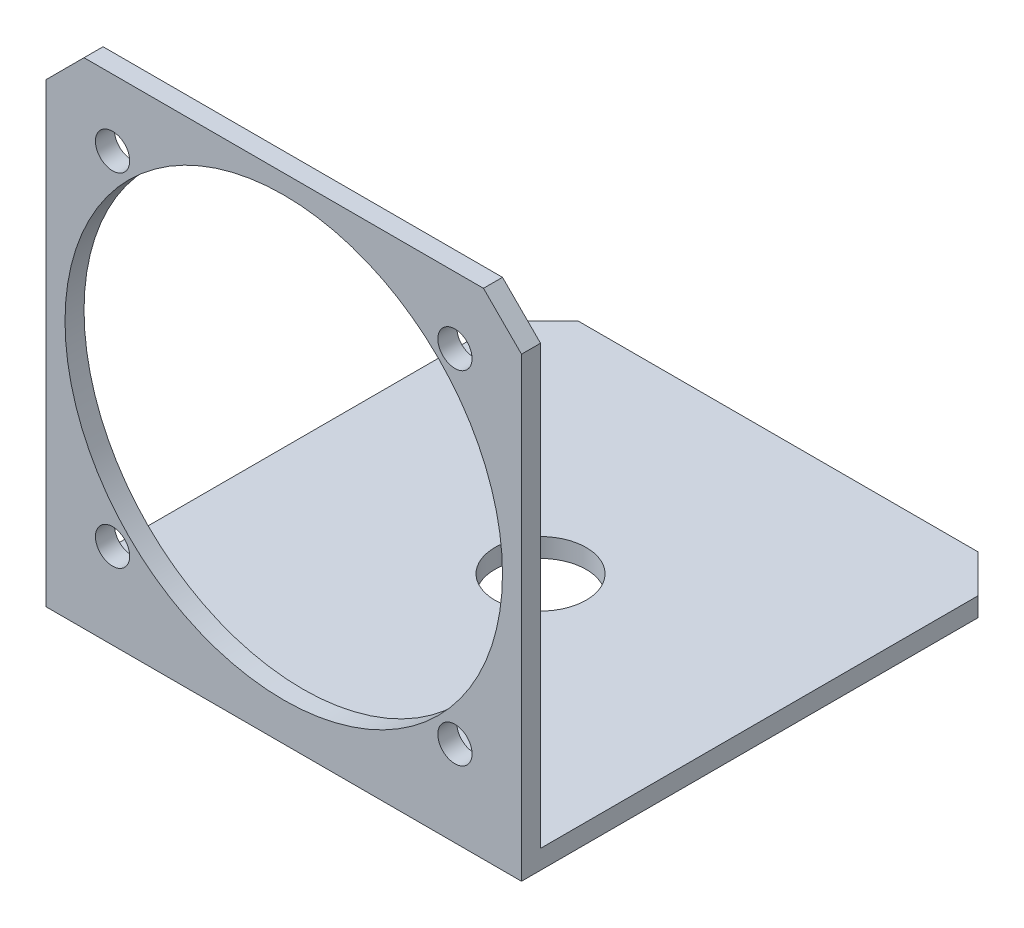
ISO-10303-21;
HEADER;
FILE_DESCRIPTION(('STEP AP214'),'2;1');
FILE_NAME('part.step','',(''),(''),'','','');
FILE_SCHEMA(('AUTOMOTIVE_DESIGN { 1 0 10303 214 1 1 1 1 }'));
ENDSEC;
DATA;
#1=APPLICATION_CONTEXT('core data for automotive mechanical design processes');
#2=APPLICATION_PROTOCOL_DEFINITION('international standard','automotive_design',2000,#1);
#3=PRODUCT_CONTEXT('',#1,'mechanical');
#4=PRODUCT('Part','Part','',(#3));
#5=PRODUCT_RELATED_PRODUCT_CATEGORY('part','',(#4));
#6=PRODUCT_DEFINITION_FORMATION('','',#4);
#7=PRODUCT_DEFINITION_CONTEXT('part definition',#1,'design');
#8=PRODUCT_DEFINITION('design','',#6,#7);
#9=PRODUCT_DEFINITION_SHAPE('','',#8);
#10=(LENGTH_UNIT() NAMED_UNIT(*) SI_UNIT(.MILLI.,.METRE.));
#11=(NAMED_UNIT(*) PLANE_ANGLE_UNIT() SI_UNIT($,.RADIAN.));
#12=(NAMED_UNIT(*) SI_UNIT($,.STERADIAN.) SOLID_ANGLE_UNIT());
#13=UNCERTAINTY_MEASURE_WITH_UNIT(LENGTH_MEASURE(1.E-05),#10,'distance_accuracy_value','');
#14=(GEOMETRIC_REPRESENTATION_CONTEXT(3) GLOBAL_UNCERTAINTY_ASSIGNED_CONTEXT((#13)) GLOBAL_UNIT_ASSIGNED_CONTEXT((#10,
#11,#12)) REPRESENTATION_CONTEXT('',''));
#15=CARTESIAN_POINT('',(0.,0.,0.));
#16=DIRECTION('',(0.,0.,1.));
#17=DIRECTION('',(1.,0.,0.));
#18=AXIS2_PLACEMENT_3D('',#15,#16,#17);
#19=CARTESIAN_POINT('',(0.,0.,1.27));
#20=DIRECTION('',(0.,0.,-1.));
#21=DIRECTION('',(-1.,0.,0.));
#22=AXIS2_PLACEMENT_3D('',#19,#20,#21);
#23=PLANE('',#22);
#24=DIRECTION('',(-1.,0.,0.));
#25=VECTOR('',#24,1.);
#26=CARTESIAN_POINT('',(-15.875,15.875,1.27));
#27=LINE('',#26,#25);
#28=CARTESIAN_POINT('',(13.335,15.875,1.27));
#29=VERTEX_POINT('',#28);
#30=CARTESIAN_POINT('',(-13.335,15.875,1.27));
#31=VERTEX_POINT('',#30);
#32=EDGE_CURVE('E134',#29,#31,#27,.T.);
#33=ORIENTED_EDGE('',*,*,#32,.T.);
#34=DIRECTION('',(0.70710678118655,0.707106781186546,0.));
#35=VECTOR('',#34,1.);
#36=CARTESIAN_POINT('',(-15.875,13.335,1.27));
#37=LINE('',#36,#35);
#38=CARTESIAN_POINT('',(-15.875,13.335,1.27));
#39=VERTEX_POINT('',#38);
#40=EDGE_CURVE('E209',#31,#39,#37,.F.);
#41=ORIENTED_EDGE('',*,*,#40,.T.);
#42=DIRECTION('',(0.,-1.,0.));
#43=VECTOR('',#42,1.);
#44=CARTESIAN_POINT('',(-15.875,-15.875,1.27));
#45=LINE('',#44,#43);
#46=CARTESIAN_POINT('',(-15.875,-17.145,1.27));
#47=VERTEX_POINT('',#46);
#48=EDGE_CURVE('E140',#39,#47,#45,.T.);
#49=ORIENTED_EDGE('',*,*,#48,.T.);
#50=DIRECTION('',(-1.,0.,0.));
#51=VECTOR('',#50,1.);
#52=CARTESIAN_POINT('',(15.875,-17.145,1.27));
#53=LINE('',#52,#51);
#54=CARTESIAN_POINT('',(15.875,-17.145,1.27));
#55=VERTEX_POINT('',#54);
#56=EDGE_CURVE('E119',#55,#47,#53,.T.);
#57=ORIENTED_EDGE('',*,*,#56,.F.);
#58=DIRECTION('',(0.,1.,0.));
#59=VECTOR('',#58,1.);
#60=CARTESIAN_POINT('',(15.875,-15.875,1.27));
#61=LINE('',#60,#59);
#62=CARTESIAN_POINT('',(15.875,13.335,1.27));
#63=VERTEX_POINT('',#62);
#64=EDGE_CURVE('E127',#55,#63,#61,.T.);
#65=ORIENTED_EDGE('',*,*,#64,.T.);
#66=DIRECTION('',(0.707106781186546,-0.70710678118655,0.));
#67=VECTOR('',#66,1.);
#68=CARTESIAN_POINT('',(13.335,15.875,1.27));
#69=LINE('',#68,#67);
#70=EDGE_CURVE('E207',#63,#29,#69,.F.);
#71=ORIENTED_EDGE('',*,*,#70,.T.);
#72=EDGE_LOOP('',(#33,#41,#49,#57,#65,#71));
#73=FACE_BOUND('',#72,.T.);
#74=CARTESIAN_POINT('',(-11.43,11.43,1.27));
#75=DIRECTION('',(0.,0.,1.));
#76=DIRECTION('',(1.,0.,0.));
#77=AXIS2_PLACEMENT_3D('',#74,#75,#76);
#78=CIRCLE('',#77,1.143);
#79=CARTESIAN_POINT('',(-10.287,11.43,1.27));
#80=VERTEX_POINT('',#79);
#81=EDGE_CURVE('E179',#80,#80,#78,.T.);
#82=ORIENTED_EDGE('',*,*,#81,.F.);
#83=EDGE_LOOP('',(#82));
#84=FACE_BOUND('',#83,.T.);
#85=CARTESIAN_POINT('',(11.43,11.43,1.27));
#86=DIRECTION('',(0.,0.,1.));
#87=DIRECTION('',(1.,0.,0.));
#88=AXIS2_PLACEMENT_3D('',#85,#86,#87);
#89=CIRCLE('',#88,1.143);
#90=CARTESIAN_POINT('',(12.573,11.43,1.27));
#91=VERTEX_POINT('',#90);
#92=EDGE_CURVE('E173',#91,#91,#89,.T.);
#93=ORIENTED_EDGE('',*,*,#92,.F.);
#94=EDGE_LOOP('',(#93));
#95=FACE_BOUND('',#94,.T.);
#96=CARTESIAN_POINT('',(-11.43,-11.43,1.27));
#97=DIRECTION('',(0.,0.,1.));
#98=DIRECTION('',(1.,0.,0.));
#99=AXIS2_PLACEMENT_3D('',#96,#97,#98);
#100=CIRCLE('',#99,1.143);
#101=CARTESIAN_POINT('',(-10.287,-11.43,1.27));
#102=VERTEX_POINT('',#101);
#103=EDGE_CURVE('E167',#102,#102,#100,.T.);
#104=ORIENTED_EDGE('',*,*,#103,.F.);
#105=EDGE_LOOP('',(#104));
#106=FACE_BOUND('',#105,.T.);
#107=CARTESIAN_POINT('',(11.43,-11.43,1.27));
#108=DIRECTION('',(0.,0.,1.));
#109=DIRECTION('',(1.,0.,0.));
#110=AXIS2_PLACEMENT_3D('',#107,#108,#109);
#111=CIRCLE('',#110,1.143);
#112=CARTESIAN_POINT('',(12.573,-11.43,1.27));
#113=VERTEX_POINT('',#112);
#114=EDGE_CURVE('E161',#113,#113,#111,.T.);
#115=ORIENTED_EDGE('',*,*,#114,.F.);
#116=EDGE_LOOP('',(#115));
#117=FACE_BOUND('',#116,.T.);
#118=CARTESIAN_POINT('',(0.,0.,1.27));
#119=DIRECTION('',(0.,0.,1.));
#120=DIRECTION('',(1.,0.,0.));
#121=AXIS2_PLACEMENT_3D('',#118,#119,#120);
#122=CIRCLE('',#121,14.605);
#123=CARTESIAN_POINT('',(14.605,0.,1.27));
#124=VERTEX_POINT('',#123);
#125=EDGE_CURVE('E155',#124,#124,#122,.T.);
#126=ORIENTED_EDGE('',*,*,#125,.F.);
#127=EDGE_LOOP('',(#126));
#128=FACE_BOUND('',#127,.T.);
#129=ADVANCED_FACE('F35',(#73,#84,#95,#106,#117,#128),#23,.F.);
#130=CARTESIAN_POINT('',(0.,0.,0.));
#131=DIRECTION('',(0.,0.,-1.));
#132=DIRECTION('',(-1.,0.,0.));
#133=AXIS2_PLACEMENT_3D('',#130,#131,#132);
#134=PLANE('',#133);
#135=CARTESIAN_POINT('',(11.43,-11.43,0.));
#136=DIRECTION('',(0.,0.,1.));
#137=DIRECTION('',(1.,0.,0.));
#138=AXIS2_PLACEMENT_3D('',#135,#136,#137);
#139=CIRCLE('',#138,1.143);
#140=CARTESIAN_POINT('',(12.573,-11.43,0.));
#141=VERTEX_POINT('',#140);
#142=EDGE_CURVE('E158',#141,#141,#139,.T.);
#143=ORIENTED_EDGE('',*,*,#142,.T.);
#144=EDGE_LOOP('',(#143));
#145=FACE_BOUND('',#144,.T.);
#146=CARTESIAN_POINT('',(11.43,11.43,0.));
#147=DIRECTION('',(0.,0.,1.));
#148=DIRECTION('',(1.,0.,0.));
#149=AXIS2_PLACEMENT_3D('',#146,#147,#148);
#150=CIRCLE('',#149,1.143);
#151=CARTESIAN_POINT('',(12.573,11.43,0.));
#152=VERTEX_POINT('',#151);
#153=EDGE_CURVE('E170',#152,#152,#150,.T.);
#154=ORIENTED_EDGE('',*,*,#153,.T.);
#155=EDGE_LOOP('',(#154));
#156=FACE_BOUND('',#155,.T.);
#157=DIRECTION('',(0.,-1.,0.));
#158=VECTOR('',#157,1.);
#159=CARTESIAN_POINT('',(-15.875,-15.875,0.));
#160=LINE('',#159,#158);
#161=CARTESIAN_POINT('',(-15.875,13.335,0.));
#162=VERTEX_POINT('',#161);
#163=CARTESIAN_POINT('',(-15.875,-15.875,0.));
#164=VERTEX_POINT('',#163);
#165=EDGE_CURVE('E192',#162,#164,#160,.T.);
#166=ORIENTED_EDGE('',*,*,#165,.F.);
#167=DIRECTION('',(-0.70710678118655,-0.707106781186546,0.));
#168=VECTOR('',#167,1.);
#169=CARTESIAN_POINT('',(-14.605,14.605,0.));
#170=LINE('',#169,#168);
#171=CARTESIAN_POINT('',(-13.335,15.875,0.));
#172=VERTEX_POINT('',#171);
#173=EDGE_CURVE('E200',#162,#172,#170,.F.);
#174=ORIENTED_EDGE('',*,*,#173,.T.);
#175=DIRECTION('',(-1.,0.,0.));
#176=VECTOR('',#175,1.);
#177=CARTESIAN_POINT('',(-15.875,15.875,0.));
#178=LINE('',#177,#176);
#179=CARTESIAN_POINT('',(13.335,15.875,0.));
#180=VERTEX_POINT('',#179);
#181=EDGE_CURVE('E189',#180,#172,#178,.T.);
#182=ORIENTED_EDGE('',*,*,#181,.F.);
#183=DIRECTION('',(-0.707106781186546,0.70710678118655,0.));
#184=VECTOR('',#183,1.);
#185=CARTESIAN_POINT('',(14.605,14.605,0.));
#186=LINE('',#185,#184);
#187=CARTESIAN_POINT('',(15.875,13.335,0.));
#188=VERTEX_POINT('',#187);
#189=EDGE_CURVE('E198',#180,#188,#186,.F.);
#190=ORIENTED_EDGE('',*,*,#189,.T.);
#191=DIRECTION('',(0.,1.,0.));
#192=VECTOR('',#191,1.);
#193=CARTESIAN_POINT('',(15.875,-15.875,0.));
#194=LINE('',#193,#192);
#195=CARTESIAN_POINT('',(15.875,-15.875,0.));
#196=VERTEX_POINT('',#195);
#197=EDGE_CURVE('E182',#196,#188,#194,.T.);
#198=ORIENTED_EDGE('',*,*,#197,.F.);
#199=DIRECTION('',(1.,0.,0.));
#200=VECTOR('',#199,1.);
#201=CARTESIAN_POINT('',(-15.875,-15.875,0.));
#202=LINE('',#201,#200);
#203=EDGE_CURVE('E135',#164,#196,#202,.T.);
#204=ORIENTED_EDGE('',*,*,#203,.F.);
#205=EDGE_LOOP('',(#166,#174,#182,#190,#198,#204));
#206=FACE_BOUND('',#205,.T.);
#207=CARTESIAN_POINT('',(-11.43,11.43,0.));
#208=DIRECTION('',(0.,0.,1.));
#209=DIRECTION('',(1.,0.,0.));
#210=AXIS2_PLACEMENT_3D('',#207,#208,#209);
#211=CIRCLE('',#210,1.143);
#212=CARTESIAN_POINT('',(-10.287,11.43,0.));
#213=VERTEX_POINT('',#212);
#214=EDGE_CURVE('E176',#213,#213,#211,.T.);
#215=ORIENTED_EDGE('',*,*,#214,.T.);
#216=EDGE_LOOP('',(#215));
#217=FACE_BOUND('',#216,.T.);
#218=CARTESIAN_POINT('',(-11.43,-11.43,0.));
#219=DIRECTION('',(0.,0.,1.));
#220=DIRECTION('',(1.,0.,0.));
#221=AXIS2_PLACEMENT_3D('',#218,#219,#220);
#222=CIRCLE('',#221,1.143);
#223=CARTESIAN_POINT('',(-10.287,-11.43,0.));
#224=VERTEX_POINT('',#223);
#225=EDGE_CURVE('E164',#224,#224,#222,.T.);
#226=ORIENTED_EDGE('',*,*,#225,.T.);
#227=EDGE_LOOP('',(#226));
#228=FACE_BOUND('',#227,.T.);
#229=CARTESIAN_POINT('',(0.,0.,0.));
#230=DIRECTION('',(0.,0.,1.));
#231=DIRECTION('',(1.,0.,0.));
#232=AXIS2_PLACEMENT_3D('',#229,#230,#231);
#233=CIRCLE('',#232,14.605);
#234=CARTESIAN_POINT('',(14.605,0.,0.));
#235=VERTEX_POINT('',#234);
#236=EDGE_CURVE('E148',#235,#235,#233,.T.);
#237=ORIENTED_EDGE('',*,*,#236,.T.);
#238=EDGE_LOOP('',(#237));
#239=FACE_BOUND('',#238,.T.);
#240=ADVANCED_FACE('F238',(#145,#156,#206,#217,#228,#239),#134,.T.);
#241=CARTESIAN_POINT('',(15.875,-15.875,1.27));
#242=DIRECTION('',(-1.,0.,0.));
#243=DIRECTION('',(0.,0.,1.));
#244=AXIS2_PLACEMENT_3D('',#241,#242,#243);
#245=PLANE('',#244);
#246=DIRECTION('',(0.,0.,1.));
#247=VECTOR('',#246,1.);
#248=CARTESIAN_POINT('',(15.875,-17.145,1.27));
#249=LINE('',#248,#247);
#250=CARTESIAN_POINT('',(15.875,-17.145,-29.21));
#251=VERTEX_POINT('',#250);
#252=EDGE_CURVE('E115',#251,#55,#249,.T.);
#253=ORIENTED_EDGE('',*,*,#252,.F.);
#254=DIRECTION('',(0.,1.,0.));
#255=VECTOR('',#254,1.);
#256=CARTESIAN_POINT('',(15.875,-15.875,-29.21));
#257=LINE('',#256,#255);
#258=CARTESIAN_POINT('',(15.875,-15.875,-29.21));
#259=VERTEX_POINT('',#258);
#260=EDGE_CURVE('E212',#251,#259,#257,.T.);
#261=ORIENTED_EDGE('',*,*,#260,.T.);
#262=DIRECTION('',(0.,0.,1.));
#263=VECTOR('',#262,1.);
#264=CARTESIAN_POINT('',(15.875,-15.875,1.27));
#265=LINE('',#264,#263);
#266=EDGE_CURVE('E149',#259,#196,#265,.T.);
#267=ORIENTED_EDGE('',*,*,#266,.T.);
#268=ORIENTED_EDGE('',*,*,#197,.T.);
#269=DIRECTION('',(0.,0.,1.));
#270=VECTOR('',#269,1.);
#271=CARTESIAN_POINT('',(15.875,13.335,1.27));
#272=LINE('',#271,#270);
#273=EDGE_CURVE('E131',#188,#63,#272,.T.);
#274=ORIENTED_EDGE('',*,*,#273,.T.);
#275=ORIENTED_EDGE('',*,*,#64,.F.);
#276=EDGE_LOOP('',(#253,#261,#267,#268,#274,#275));
#277=FACE_BOUND('',#276,.T.);
#278=ADVANCED_FACE('F128',(#277),#245,.F.);
#279=CARTESIAN_POINT('',(-15.875,15.875,1.27));
#280=DIRECTION('',(0.,-1.,0.));
#281=DIRECTION('',(0.,0.,-1.));
#282=AXIS2_PLACEMENT_3D('',#279,#280,#281);
#283=PLANE('',#282);
#284=ORIENTED_EDGE('',*,*,#181,.T.);
#285=DIRECTION('',(0.,0.,1.));
#286=VECTOR('',#285,1.);
#287=CARTESIAN_POINT('',(-13.335,15.875,1.27));
#288=LINE('',#287,#286);
#289=EDGE_CURVE('E205',#172,#31,#288,.T.);
#290=ORIENTED_EDGE('',*,*,#289,.T.);
#291=ORIENTED_EDGE('',*,*,#32,.F.);
#292=DIRECTION('',(0.,0.,-1.));
#293=VECTOR('',#292,1.);
#294=CARTESIAN_POINT('',(13.335,15.875,1.27));
#295=LINE('',#294,#293);
#296=EDGE_CURVE('E202',#29,#180,#295,.T.);
#297=ORIENTED_EDGE('',*,*,#296,.T.);
#298=EDGE_LOOP('',(#284,#290,#291,#297));
#299=FACE_BOUND('',#298,.T.);
#300=ADVANCED_FACE('F265',(#299),#283,.F.);
#301=CARTESIAN_POINT('',(-15.875,-15.875,1.27));
#302=DIRECTION('',(1.,0.,0.));
#303=DIRECTION('',(0.,0.,-1.));
#304=AXIS2_PLACEMENT_3D('',#301,#302,#303);
#305=PLANE('',#304);
#306=DIRECTION('',(0.,0.,-1.));
#307=VECTOR('',#306,1.);
#308=CARTESIAN_POINT('',(-15.875,-15.875,1.27));
#309=LINE('',#308,#307);
#310=CARTESIAN_POINT('',(-15.875,-15.875,-29.21));
#311=VERTEX_POINT('',#310);
#312=EDGE_CURVE('E151',#164,#311,#309,.T.);
#313=ORIENTED_EDGE('',*,*,#312,.T.);
#314=DIRECTION('',(0.,-1.,0.));
#315=VECTOR('',#314,1.);
#316=CARTESIAN_POINT('',(-15.875,-15.875,-29.21));
#317=LINE('',#316,#315);
#318=CARTESIAN_POINT('',(-15.875,-17.145,-29.21));
#319=VERTEX_POINT('',#318);
#320=EDGE_CURVE('E11',#311,#319,#317,.T.);
#321=ORIENTED_EDGE('',*,*,#320,.T.);
#322=DIRECTION('',(0.,0.,-1.));
#323=VECTOR('',#322,1.);
#324=CARTESIAN_POINT('',(-15.875,-17.145,1.27));
#325=LINE('',#324,#323);
#326=EDGE_CURVE('E141',#47,#319,#325,.T.);
#327=ORIENTED_EDGE('',*,*,#326,.F.);
#328=ORIENTED_EDGE('',*,*,#48,.F.);
#329=DIRECTION('',(0.,0.,-1.));
#330=VECTOR('',#329,1.);
#331=CARTESIAN_POINT('',(-15.875,13.335,1.27));
#332=LINE('',#331,#330);
#333=EDGE_CURVE('E187',#39,#162,#332,.T.);
#334=ORIENTED_EDGE('',*,*,#333,.T.);
#335=ORIENTED_EDGE('',*,*,#165,.T.);
#336=EDGE_LOOP('',(#313,#321,#327,#328,#334,#335));
#337=FACE_BOUND('',#336,.T.);
#338=ADVANCED_FACE('F232',(#337),#305,.F.);
#339=CARTESIAN_POINT('',(-11.43,11.43,1.27));
#340=DIRECTION('',(0.,0.,-1.));
#341=DIRECTION('',(-1.,0.,0.));
#342=AXIS2_PLACEMENT_3D('',#339,#340,#341);
#343=CYLINDRICAL_SURFACE('',#342,1.143);
#344=ORIENTED_EDGE('',*,*,#81,.T.);
#345=EDGE_LOOP('',(#344));
#346=FACE_BOUND('',#345,.T.);
#347=ORIENTED_EDGE('',*,*,#214,.F.);
#348=EDGE_LOOP('',(#347));
#349=FACE_BOUND('',#348,.T.);
#350=ADVANCED_FACE('F260',(#346,#349),#343,.F.);
#351=CARTESIAN_POINT('',(11.43,11.43,1.27));
#352=DIRECTION('',(0.,0.,-1.));
#353=DIRECTION('',(-1.,0.,0.));
#354=AXIS2_PLACEMENT_3D('',#351,#352,#353);
#355=CYLINDRICAL_SURFACE('',#354,1.143);
#356=ORIENTED_EDGE('',*,*,#92,.T.);
#357=EDGE_LOOP('',(#356));
#358=FACE_BOUND('',#357,.T.);
#359=ORIENTED_EDGE('',*,*,#153,.F.);
#360=EDGE_LOOP('',(#359));
#361=FACE_BOUND('',#360,.T.);
#362=ADVANCED_FACE('F309',(#358,#361),#355,.F.);
#363=CARTESIAN_POINT('',(-11.43,-11.43,1.27));
#364=DIRECTION('',(0.,0.,-1.));
#365=DIRECTION('',(-1.,0.,0.));
#366=AXIS2_PLACEMENT_3D('',#363,#364,#365);
#367=CYLINDRICAL_SURFACE('',#366,1.143);
#368=ORIENTED_EDGE('',*,*,#103,.T.);
#369=EDGE_LOOP('',(#368));
#370=FACE_BOUND('',#369,.T.);
#371=ORIENTED_EDGE('',*,*,#225,.F.);
#372=EDGE_LOOP('',(#371));
#373=FACE_BOUND('',#372,.T.);
#374=ADVANCED_FACE('F306',(#370,#373),#367,.F.);
#375=CARTESIAN_POINT('',(11.43,-11.43,1.27));
#376=DIRECTION('',(0.,0.,-1.));
#377=DIRECTION('',(-1.,0.,0.));
#378=AXIS2_PLACEMENT_3D('',#375,#376,#377);
#379=CYLINDRICAL_SURFACE('',#378,1.143);
#380=ORIENTED_EDGE('',*,*,#114,.T.);
#381=EDGE_LOOP('',(#380));
#382=FACE_BOUND('',#381,.T.);
#383=ORIENTED_EDGE('',*,*,#142,.F.);
#384=EDGE_LOOP('',(#383));
#385=FACE_BOUND('',#384,.T.);
#386=ADVANCED_FACE('F302',(#382,#385),#379,.F.);
#387=CARTESIAN_POINT('',(0.,0.,1.27));
#388=DIRECTION('',(0.,0.,-1.));
#389=DIRECTION('',(-1.,0.,0.));
#390=AXIS2_PLACEMENT_3D('',#387,#388,#389);
#391=CYLINDRICAL_SURFACE('',#390,14.605);
#392=ORIENTED_EDGE('',*,*,#125,.T.);
#393=EDGE_LOOP('',(#392));
#394=FACE_BOUND('',#393,.T.);
#395=ORIENTED_EDGE('',*,*,#236,.F.);
#396=EDGE_LOOP('',(#395));
#397=FACE_BOUND('',#396,.T.);
#398=ADVANCED_FACE('F278',(#394,#397),#391,.F.);
#399=CARTESIAN_POINT('',(-15.875,13.335,1.27));
#400=DIRECTION('',(0.707106781186546,-0.70710678118655,0.));
#401=DIRECTION('',(0.,0.,-1.));
#402=AXIS2_PLACEMENT_3D('',#399,#400,#401);
#403=PLANE('',#402);
#404=ORIENTED_EDGE('',*,*,#40,.F.);
#405=ORIENTED_EDGE('',*,*,#289,.F.);
#406=ORIENTED_EDGE('',*,*,#173,.F.);
#407=ORIENTED_EDGE('',*,*,#333,.F.);
#408=EDGE_LOOP('',(#404,#405,#406,#407));
#409=FACE_BOUND('',#408,.T.);
#410=ADVANCED_FACE('F272',(#409),#403,.F.);
#411=CARTESIAN_POINT('',(13.335,15.875,1.27));
#412=DIRECTION('',(-0.70710678118655,-0.707106781186546,0.));
#413=DIRECTION('',(0.,0.,-1.));
#414=AXIS2_PLACEMENT_3D('',#411,#412,#413);
#415=PLANE('',#414);
#416=ORIENTED_EDGE('',*,*,#70,.F.);
#417=ORIENTED_EDGE('',*,*,#273,.F.);
#418=ORIENTED_EDGE('',*,*,#189,.F.);
#419=ORIENTED_EDGE('',*,*,#296,.F.);
#420=EDGE_LOOP('',(#416,#417,#418,#419));
#421=FACE_BOUND('',#420,.T.);
#422=ADVANCED_FACE('F277',(#421),#415,.F.);
#423=CARTESIAN_POINT('',(15.875,-17.145,-31.75));
#424=DIRECTION('',(0.,0.,1.));
#425=DIRECTION('',(1.,0.,0.));
#426=AXIS2_PLACEMENT_3D('',#423,#424,#425);
#427=PLANE('',#426);
#428=DIRECTION('',(1.,0.,0.));
#429=VECTOR('',#428,1.);
#430=CARTESIAN_POINT('',(15.875,-15.875,-31.75));
#431=LINE('',#430,#429);
#432=CARTESIAN_POINT('',(-13.335,-15.875,-31.75));
#433=VERTEX_POINT('',#432);
#434=CARTESIAN_POINT('',(13.335,-15.875,-31.75));
#435=VERTEX_POINT('',#434);
#436=EDGE_CURVE('E124',#433,#435,#431,.T.);
#437=ORIENTED_EDGE('',*,*,#436,.T.);
#438=DIRECTION('',(0.,-1.,0.));
#439=VECTOR('',#438,1.);
#440=CARTESIAN_POINT('',(13.335,-17.145,-31.75));
#441=LINE('',#440,#439);
#442=CARTESIAN_POINT('',(13.335,-17.145,-31.75));
#443=VERTEX_POINT('',#442);
#444=EDGE_CURVE('E57',#435,#443,#441,.T.);
#445=ORIENTED_EDGE('',*,*,#444,.T.);
#446=DIRECTION('',(1.,0.,0.));
#447=VECTOR('',#446,1.);
#448=CARTESIAN_POINT('',(15.875,-17.145,-31.75));
#449=LINE('',#448,#447);
#450=CARTESIAN_POINT('',(-13.335,-17.145,-31.75));
#451=VERTEX_POINT('',#450);
#452=EDGE_CURVE('E143',#451,#443,#449,.T.);
#453=ORIENTED_EDGE('',*,*,#452,.F.);
#454=DIRECTION('',(0.,1.,0.));
#455=VECTOR('',#454,1.);
#456=CARTESIAN_POINT('',(-13.335,-17.145,-31.75));
#457=LINE('',#456,#455);
#458=EDGE_CURVE('E218',#451,#433,#457,.T.);
#459=ORIENTED_EDGE('',*,*,#458,.T.);
#460=EDGE_LOOP('',(#437,#445,#453,#459));
#461=FACE_BOUND('',#460,.T.);
#462=ADVANCED_FACE('F226',(#461),#427,.F.);
#463=CARTESIAN_POINT('',(0.,-17.145,0.));
#464=DIRECTION('',(0.,1.,0.));
#465=DIRECTION('',(0.,0.,1.));
#466=AXIS2_PLACEMENT_3D('',#463,#464,#465);
#467=PLANE('',#466);
#468=CARTESIAN_POINT('',(0.,-17.145,-15.875));
#469=DIRECTION('',(0.,1.,0.));
#470=DIRECTION('',(0.,0.,1.));
#471=AXIS2_PLACEMENT_3D('',#468,#469,#470);
#472=CIRCLE('',#471,3.048);
#473=CARTESIAN_POINT('',(0.,-17.145,-12.827));
#474=VERTEX_POINT('',#473);
#475=EDGE_CURVE('E152',#474,#474,#472,.T.);
#476=ORIENTED_EDGE('',*,*,#475,.T.);
#477=EDGE_LOOP('',(#476));
#478=FACE_BOUND('',#477,.T.);
#479=ORIENTED_EDGE('',*,*,#452,.T.);
#480=DIRECTION('',(-0.707106781186549,0.,-0.707106781186547));
#481=VECTOR('',#480,1.);
#482=CARTESIAN_POINT('',(15.875,-17.145,-29.21));
#483=LINE('',#482,#481);
#484=EDGE_CURVE('E44',#443,#251,#483,.F.);
#485=ORIENTED_EDGE('',*,*,#484,.T.);
#486=ORIENTED_EDGE('',*,*,#252,.T.);
#487=ORIENTED_EDGE('',*,*,#56,.T.);
#488=ORIENTED_EDGE('',*,*,#326,.T.);
#489=DIRECTION('',(-0.707106781186546,0.,0.707106781186549));
#490=VECTOR('',#489,1.);
#491=CARTESIAN_POINT('',(-13.335,-17.145,-31.75));
#492=LINE('',#491,#490);
#493=EDGE_CURVE('E222',#319,#451,#492,.F.);
#494=ORIENTED_EDGE('',*,*,#493,.T.);
#495=EDGE_LOOP('',(#479,#485,#486,#487,#488,#494));
#496=FACE_BOUND('',#495,.T.);
#497=ADVANCED_FACE('F117',(#478,#496),#467,.F.);
#498=CARTESIAN_POINT('',(0.,-15.875,0.));
#499=DIRECTION('',(0.,1.,0.));
#500=DIRECTION('',(0.,0.,1.));
#501=AXIS2_PLACEMENT_3D('',#498,#499,#500);
#502=PLANE('',#501);
#503=CARTESIAN_POINT('',(0.,-15.875,-15.875));
#504=DIRECTION('',(0.,1.,0.));
#505=DIRECTION('',(0.,0.,1.));
#506=AXIS2_PLACEMENT_3D('',#503,#504,#505);
#507=CIRCLE('',#506,3.048);
#508=CARTESIAN_POINT('',(0.,-15.875,-12.827));
#509=VERTEX_POINT('',#508);
#510=EDGE_CURVE('E450',#509,#509,#507,.T.);
#511=ORIENTED_EDGE('',*,*,#510,.F.);
#512=EDGE_LOOP('',(#511));
#513=FACE_BOUND('',#512,.T.);
#514=ORIENTED_EDGE('',*,*,#266,.F.);
#515=DIRECTION('',(0.707106781186549,0.,0.707106781186547));
#516=VECTOR('',#515,1.);
#517=CARTESIAN_POINT('',(22.5425,-15.875,-22.5425));
#518=LINE('',#517,#516);
#519=EDGE_CURVE('E216',#259,#435,#518,.F.);
#520=ORIENTED_EDGE('',*,*,#519,.T.);
#521=ORIENTED_EDGE('',*,*,#436,.F.);
#522=DIRECTION('',(0.707106781186546,0.,-0.707106781186549));
#523=VECTOR('',#522,1.);
#524=CARTESIAN_POINT('',(-22.5425,-15.875,-22.5424999999999));
#525=LINE('',#524,#523);
#526=EDGE_CURVE('E214',#433,#311,#525,.F.);
#527=ORIENTED_EDGE('',*,*,#526,.T.);
#528=ORIENTED_EDGE('',*,*,#312,.F.);
#529=ORIENTED_EDGE('',*,*,#203,.T.);
#530=EDGE_LOOP('',(#514,#520,#521,#527,#528,#529));
#531=FACE_BOUND('',#530,.T.);
#532=ADVANCED_FACE('F231',(#513,#531),#502,.T.);
#533=CARTESIAN_POINT('',(0.,-17.145,-15.875));
#534=DIRECTION('',(0.,1.,0.));
#535=DIRECTION('',(0.,0.,1.));
#536=AXIS2_PLACEMENT_3D('',#533,#534,#535);
#537=CYLINDRICAL_SURFACE('',#536,3.048);
#538=ORIENTED_EDGE('',*,*,#475,.F.);
#539=EDGE_LOOP('',(#538));
#540=FACE_BOUND('',#539,.T.);
#541=ORIENTED_EDGE('',*,*,#510,.T.);
#542=EDGE_LOOP('',(#541));
#543=FACE_BOUND('',#542,.T.);
#544=ADVANCED_FACE('F243',(#540,#543),#537,.F.);
#545=CARTESIAN_POINT('',(15.875,-15.875,-29.21));
#546=DIRECTION('',(-0.707106781186547,0.,0.707106781186549));
#547=DIRECTION('',(0.,1.,0.));
#548=AXIS2_PLACEMENT_3D('',#545,#546,#547);
#549=PLANE('',#548);
#550=ORIENTED_EDGE('',*,*,#484,.F.);
#551=ORIENTED_EDGE('',*,*,#444,.F.);
#552=ORIENTED_EDGE('',*,*,#519,.F.);
#553=ORIENTED_EDGE('',*,*,#260,.F.);
#554=EDGE_LOOP('',(#550,#551,#552,#553));
#555=FACE_BOUND('',#554,.T.);
#556=ADVANCED_FACE('F241',(#555),#549,.F.);
#557=CARTESIAN_POINT('',(-13.335,-17.145,-31.75));
#558=DIRECTION('',(0.707106781186549,0.,0.707106781186546));
#559=DIRECTION('',(0.,1.,0.));
#560=AXIS2_PLACEMENT_3D('',#557,#558,#559);
#561=PLANE('',#560);
#562=ORIENTED_EDGE('',*,*,#493,.F.);
#563=ORIENTED_EDGE('',*,*,#320,.F.);
#564=ORIENTED_EDGE('',*,*,#526,.F.);
#565=ORIENTED_EDGE('',*,*,#458,.F.);
#566=EDGE_LOOP('',(#562,#563,#564,#565));
#567=FACE_BOUND('',#566,.T.);
#568=ADVANCED_FACE('F38',(#567),#561,.F.);
#569=CLOSED_SHELL('',(#129,#240,#278,#300,#338,#350,#362,#374,#386,#398,#410,#422,#462,#497,
#532,#544,#556,#568));
#570=MANIFOLD_SOLID_BREP('B2',#569);
#571=ADVANCED_BREP_SHAPE_REPRESENTATION('',(#18,#570),#14);
#572=SHAPE_DEFINITION_REPRESENTATION(#9,#571);
ENDSEC;
END-ISO-10303-21;
